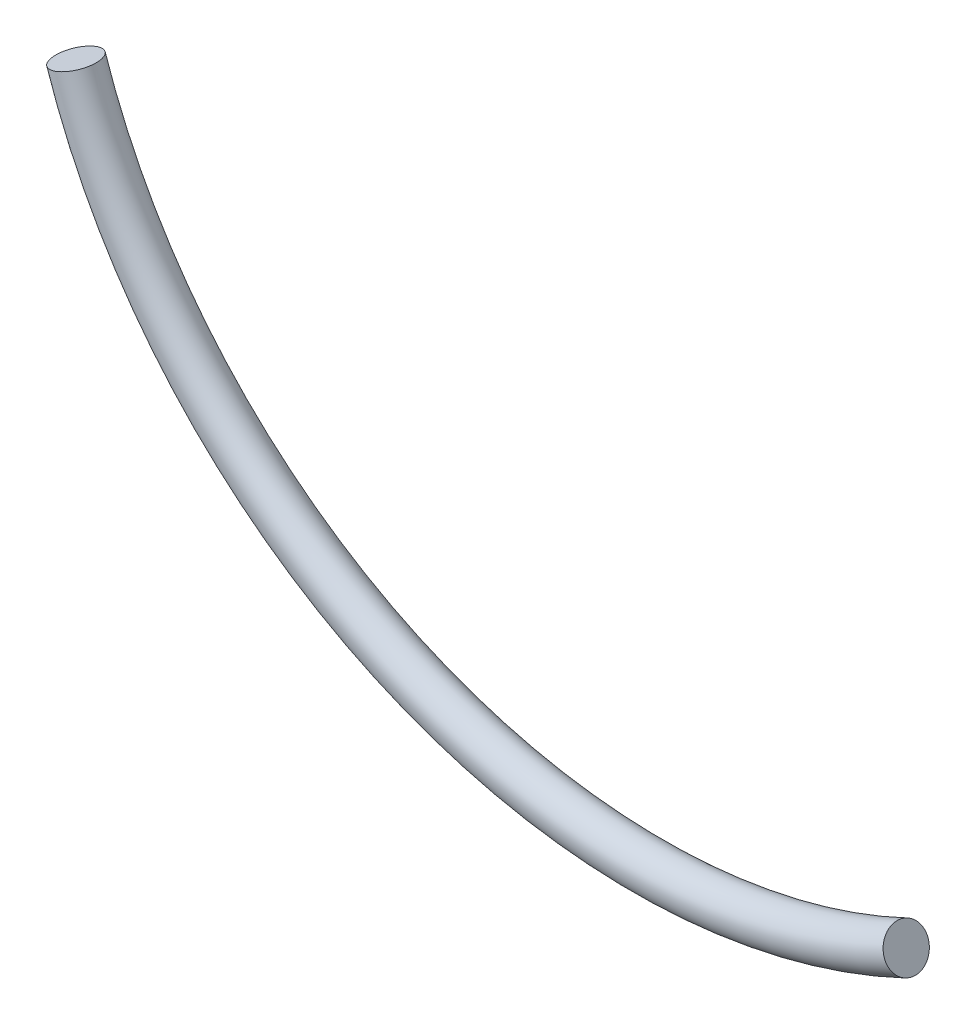
ISO-10303-21;
HEADER;
FILE_DESCRIPTION(('STEP AP214'),'2;1');
FILE_NAME('part.step','',(''),(''),'','','');
FILE_SCHEMA(('AUTOMOTIVE_DESIGN { 1 0 10303 214 1 1 1 1 }'));
ENDSEC;
DATA;
#1=APPLICATION_CONTEXT('core data for automotive mechanical design processes');
#2=APPLICATION_PROTOCOL_DEFINITION('international standard','automotive_design',2000,#1);
#3=PRODUCT_CONTEXT('',#1,'mechanical');
#4=PRODUCT('Part','Part','',(#3));
#5=PRODUCT_RELATED_PRODUCT_CATEGORY('part','',(#4));
#6=PRODUCT_DEFINITION_FORMATION('','',#4);
#7=PRODUCT_DEFINITION_CONTEXT('part definition',#1,'design');
#8=PRODUCT_DEFINITION('design','',#6,#7);
#9=PRODUCT_DEFINITION_SHAPE('','',#8);
#10=(LENGTH_UNIT() NAMED_UNIT(*) SI_UNIT(.MILLI.,.METRE.));
#11=(NAMED_UNIT(*) PLANE_ANGLE_UNIT() SI_UNIT($,.RADIAN.));
#12=(NAMED_UNIT(*) SI_UNIT($,.STERADIAN.) SOLID_ANGLE_UNIT());
#13=UNCERTAINTY_MEASURE_WITH_UNIT(LENGTH_MEASURE(1.E-05),#10,'distance_accuracy_value','');
#14=(GEOMETRIC_REPRESENTATION_CONTEXT(3) GLOBAL_UNCERTAINTY_ASSIGNED_CONTEXT((#13)) GLOBAL_UNIT_ASSIGNED_CONTEXT((#10,
#11,#12)) REPRESENTATION_CONTEXT('',''));
#15=CARTESIAN_POINT('',(0.,0.,0.));
#16=DIRECTION('',(0.,0.,1.));
#17=DIRECTION('',(1.,0.,0.));
#18=AXIS2_PLACEMENT_3D('',#15,#16,#17);
#19=CARTESIAN_POINT('',(3006.98339911165,-1889.90072908665,0.));
#20=DIRECTION('',(0.,0.,-1.));
#21=DIRECTION('',(-1.,0.,0.));
#22=AXIS2_PLACEMENT_3D('',#19,#20,#21);
#23=TOROIDAL_SURFACE('',#22,1440.12936036618,50.8000000000001);
#24=CARTESIAN_POINT('',(3623.90816121548,-3191.19870130203,0.));
#25=DIRECTION('',(0.90359797392402,0.428381490637032,0.));
#26=DIRECTION('',(-0.428381490637032,0.90359797392402,0.));
#27=AXIS2_PLACEMENT_3D('',#24,#25,#26);
#28=CIRCLE('',#27,50.8000000000001);
#29=CARTESIAN_POINT('',(3645.66994093984,-3237.10147837737,0.));
#30=VERTEX_POINT('',#29);
#31=EDGE_CURVE('E10',#30,#30,#28,.T.);
#32=CARTESIAN_POINT('',(1640.10479327096,-2343.34912910997,0.));
#33=DIRECTION('',(0.31486643665679,-0.949135989764931,0.));
#34=DIRECTION('',(0.949135989764931,0.31486643665679,0.));
#35=AXIS2_PLACEMENT_3D('',#32,#33,#34);
#36=CIRCLE('',#35,50.8000000000001);
#37=CARTESIAN_POINT('',(1591.8886849909,-2359.34434409214,0.));
#38=VERTEX_POINT('',#37);
#39=EDGE_CURVE('E41',#38,#38,#36,.T.);
#40=CARTESIAN_POINT('',(3006.98339911165,-1889.90072908665,0.));
#41=DIRECTION('',(0.,0.,-1.));
#42=DIRECTION('',(-1.,0.,0.));
#43=AXIS2_PLACEMENT_3D('',#40,#41,#42);
#44=CIRCLE('',#43,1490.92936036618);
#45=EDGE_CURVE('',#30,#38,#44,.T.);
#46=ORIENTED_EDGE('',*,*,#31,.F.);
#47=ORIENTED_EDGE('',*,*,#39,.T.);
#48=ORIENTED_EDGE('',*,*,#45,.T.);
#49=ORIENTED_EDGE('',*,*,#45,.F.);
#50=EDGE_LOOP('',(#46,#48,#47,#49));
#51=FACE_BOUND('',#50,.T.);
#52=ADVANCED_FACE('F35',(#51),#23,.T.);
#53=CARTESIAN_POINT('',(3623.90816121548,-3191.19870130203,0.));
#54=DIRECTION('',(0.90359797392402,0.428381490637032,0.));
#55=DIRECTION('',(-0.428381490637032,0.90359797392402,0.));
#56=AXIS2_PLACEMENT_3D('',#53,#54,#55);
#57=PLANE('',#56);
#58=ORIENTED_EDGE('',*,*,#31,.T.);
#59=EDGE_LOOP('',(#58));
#60=FACE_BOUND('',#59,.T.);
#61=ADVANCED_FACE('F50',(#60),#57,.T.);
#62=CARTESIAN_POINT('',(1640.10479327096,-2343.34912910997,0.));
#63=DIRECTION('',(0.31486643665679,-0.949135989764931,0.));
#64=DIRECTION('',(0.949135989764931,0.31486643665679,0.));
#65=AXIS2_PLACEMENT_3D('',#62,#63,#64);
#66=PLANE('',#65);
#67=ORIENTED_EDGE('',*,*,#39,.F.);
#68=EDGE_LOOP('',(#67));
#69=FACE_BOUND('',#68,.T.);
#70=ADVANCED_FACE('F48',(#69),#66,.F.);
#71=CLOSED_SHELL('',(#52,#61,#70));
#72=MANIFOLD_SOLID_BREP('B2',#71);
#73=ADVANCED_BREP_SHAPE_REPRESENTATION('',(#18,#72),#14);
#74=SHAPE_DEFINITION_REPRESENTATION(#9,#73);
ENDSEC;
END-ISO-10303-21;
